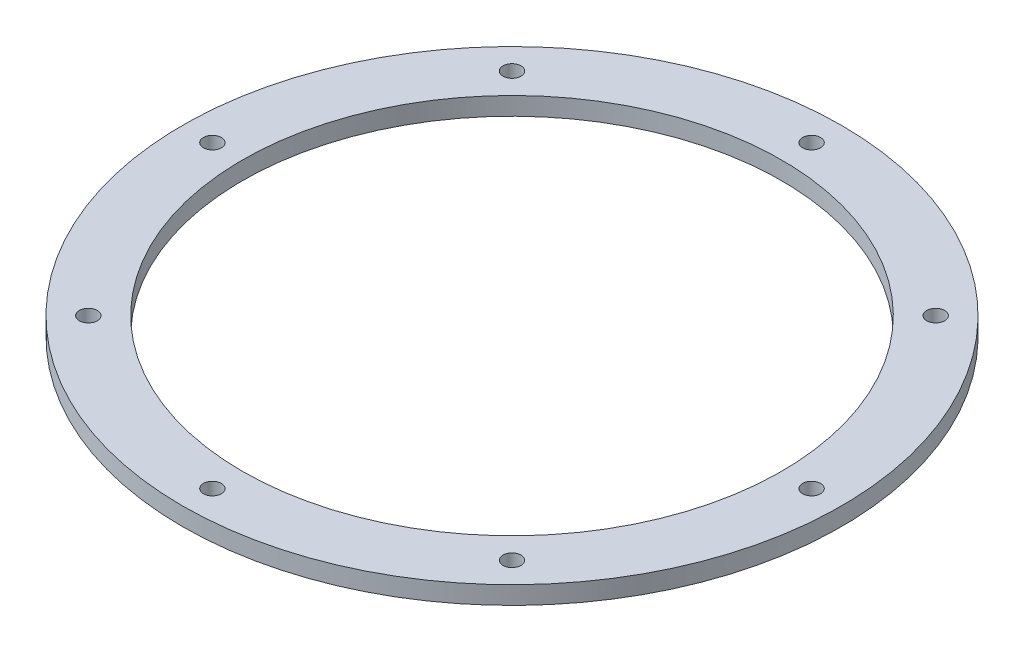
ISO-10303-21;
HEADER;
FILE_DESCRIPTION(('STEP AP214'),'2;1');
FILE_NAME('part.step','',(''),(''),'','','');
FILE_SCHEMA(('AUTOMOTIVE_DESIGN { 1 0 10303 214 1 1 1 1 }'));
ENDSEC;
DATA;
#1=APPLICATION_CONTEXT('core data for automotive mechanical design processes');
#2=APPLICATION_PROTOCOL_DEFINITION('international standard','automotive_design',2000,#1);
#3=PRODUCT_CONTEXT('',#1,'mechanical');
#4=PRODUCT('Part','Part','',(#3));
#5=PRODUCT_RELATED_PRODUCT_CATEGORY('part','',(#4));
#6=PRODUCT_DEFINITION_FORMATION('','',#4);
#7=PRODUCT_DEFINITION_CONTEXT('part definition',#1,'design');
#8=PRODUCT_DEFINITION('design','',#6,#7);
#9=PRODUCT_DEFINITION_SHAPE('','',#8);
#10=(LENGTH_UNIT() NAMED_UNIT(*) SI_UNIT(.MILLI.,.METRE.));
#11=(NAMED_UNIT(*) PLANE_ANGLE_UNIT() SI_UNIT($,.RADIAN.));
#12=(NAMED_UNIT(*) SI_UNIT($,.STERADIAN.) SOLID_ANGLE_UNIT());
#13=UNCERTAINTY_MEASURE_WITH_UNIT(LENGTH_MEASURE(1.E-05),#10,'distance_accuracy_value','');
#14=(GEOMETRIC_REPRESENTATION_CONTEXT(3) GLOBAL_UNCERTAINTY_ASSIGNED_CONTEXT((#13)) GLOBAL_UNIT_ASSIGNED_CONTEXT((#10,
#11,#12)) REPRESENTATION_CONTEXT('',''));
#15=CARTESIAN_POINT('',(0.,0.,0.));
#16=DIRECTION('',(0.,0.,1.));
#17=DIRECTION('',(1.,0.,0.));
#18=AXIS2_PLACEMENT_3D('',#15,#16,#17);
#19=CARTESIAN_POINT('',(0.,3.,0.));
#20=DIRECTION('',(0.,1.,0.));
#21=DIRECTION('',(0.,0.,1.));
#22=AXIS2_PLACEMENT_3D('',#19,#20,#21);
#23=PLANE('',#22);
#24=CARTESIAN_POINT('',(-50.,3.,0.));
#25=DIRECTION('',(0.,1.,0.));
#26=DIRECTION('',(0.,0.,1.));
#27=AXIS2_PLACEMENT_3D('',#24,#25,#26);
#28=CIRCLE('',#27,1.5);
#29=CARTESIAN_POINT('',(-50.,3.,1.49999999999999));
#30=VERTEX_POINT('',#29);
#31=EDGE_CURVE('E115',#30,#30,#28,.T.);
#32=ORIENTED_EDGE('',*,*,#31,.F.);
#33=EDGE_LOOP('',(#32));
#34=FACE_BOUND('',#33,.T.);
#35=CARTESIAN_POINT('',(-35.3553390593273,3.,35.3553390593274));
#36=DIRECTION('',(0.,1.,0.));
#37=DIRECTION('',(0.,0.,1.));
#38=AXIS2_PLACEMENT_3D('',#35,#36,#37);
#39=CIRCLE('',#38,1.5);
#40=CARTESIAN_POINT('',(-35.3553390593273,3.,36.8553390593274));
#41=VERTEX_POINT('',#40);
#42=EDGE_CURVE('E107',#41,#41,#39,.T.);
#43=ORIENTED_EDGE('',*,*,#42,.F.);
#44=EDGE_LOOP('',(#43));
#45=FACE_BOUND('',#44,.T.);
#46=CARTESIAN_POINT('',(0.,3.,50.));
#47=DIRECTION('',(0.,1.,0.));
#48=DIRECTION('',(0.,0.,1.));
#49=AXIS2_PLACEMENT_3D('',#46,#47,#48);
#50=CIRCLE('',#49,1.5);
#51=CARTESIAN_POINT('',(0.,3.,51.5));
#52=VERTEX_POINT('',#51);
#53=EDGE_CURVE('E99',#52,#52,#50,.T.);
#54=ORIENTED_EDGE('',*,*,#53,.F.);
#55=EDGE_LOOP('',(#54));
#56=FACE_BOUND('',#55,.T.);
#57=CARTESIAN_POINT('',(35.3553390593274,3.,35.3553390593274));
#58=DIRECTION('',(0.,1.,0.));
#59=DIRECTION('',(0.,0.,1.));
#60=AXIS2_PLACEMENT_3D('',#57,#58,#59);
#61=CIRCLE('',#60,1.5);
#62=CARTESIAN_POINT('',(35.3553390593274,3.,36.8553390593274));
#63=VERTEX_POINT('',#62);
#64=EDGE_CURVE('E90',#63,#63,#61,.T.);
#65=ORIENTED_EDGE('',*,*,#64,.F.);
#66=EDGE_LOOP('',(#65));
#67=FACE_BOUND('',#66,.T.);
#68=CARTESIAN_POINT('',(50.,3.,0.));
#69=DIRECTION('',(0.,1.,0.));
#70=DIRECTION('',(0.,0.,1.));
#71=AXIS2_PLACEMENT_3D('',#68,#69,#70);
#72=CIRCLE('',#71,1.5);
#73=CARTESIAN_POINT('',(50.,3.,1.5));
#74=VERTEX_POINT('',#73);
#75=EDGE_CURVE('E130',#74,#74,#72,.T.);
#76=ORIENTED_EDGE('',*,*,#75,.F.);
#77=EDGE_LOOP('',(#76));
#78=FACE_BOUND('',#77,.T.);
#79=CARTESIAN_POINT('',(35.3553390593273,3.,-35.3553390593274));
#80=DIRECTION('',(0.,1.,0.));
#81=DIRECTION('',(0.,0.,1.));
#82=AXIS2_PLACEMENT_3D('',#79,#80,#81);
#83=CIRCLE('',#82,1.5);
#84=CARTESIAN_POINT('',(35.3553390593273,3.,-33.8553390593274));
#85=VERTEX_POINT('',#84);
#86=EDGE_CURVE('E122',#85,#85,#83,.T.);
#87=ORIENTED_EDGE('',*,*,#86,.F.);
#88=EDGE_LOOP('',(#87));
#89=FACE_BOUND('',#88,.T.);
#90=CARTESIAN_POINT('',(-35.3553390593274,3.,-35.3553390593274));
#91=DIRECTION('',(0.,1.,0.));
#92=DIRECTION('',(0.,0.,1.));
#93=AXIS2_PLACEMENT_3D('',#90,#91,#92);
#94=CIRCLE('',#93,1.5);
#95=CARTESIAN_POINT('',(-35.3553390593274,3.,-33.8553390593274));
#96=VERTEX_POINT('',#95);
#97=EDGE_CURVE('E82',#96,#96,#94,.T.);
#98=ORIENTED_EDGE('',*,*,#97,.F.);
#99=EDGE_LOOP('',(#98));
#100=FACE_BOUND('',#99,.T.);
#101=CARTESIAN_POINT('',(0.,3.,-50.));
#102=DIRECTION('',(0.,1.,0.));
#103=DIRECTION('',(0.,0.,1.));
#104=AXIS2_PLACEMENT_3D('',#101,#102,#103);
#105=CIRCLE('',#104,1.5);
#106=CARTESIAN_POINT('',(0.,3.,-48.5));
#107=VERTEX_POINT('',#106);
#108=EDGE_CURVE('E74',#107,#107,#105,.T.);
#109=ORIENTED_EDGE('',*,*,#108,.F.);
#110=EDGE_LOOP('',(#109));
#111=FACE_BOUND('',#110,.T.);
#112=CARTESIAN_POINT('',(0.,3.,0.));
#113=DIRECTION('',(0.,1.,0.));
#114=DIRECTION('',(0.,0.,1.));
#115=AXIS2_PLACEMENT_3D('',#112,#113,#114);
#116=CIRCLE('',#115,55.);
#117=CARTESIAN_POINT('',(0.,3.,55.));
#118=VERTEX_POINT('',#117);
#119=EDGE_CURVE('E12',#118,#118,#116,.T.);
#120=ORIENTED_EDGE('',*,*,#119,.T.);
#121=EDGE_LOOP('',(#120));
#122=FACE_BOUND('',#121,.T.);
#123=CARTESIAN_POINT('',(0.,3.,0.));
#124=DIRECTION('',(0.,1.,0.));
#125=DIRECTION('',(0.,0.,1.));
#126=AXIS2_PLACEMENT_3D('',#123,#124,#125);
#127=CIRCLE('',#126,45.);
#128=CARTESIAN_POINT('',(0.,3.,45.));
#129=VERTEX_POINT('',#128);
#130=EDGE_CURVE('E64',#129,#129,#127,.T.);
#131=ORIENTED_EDGE('',*,*,#130,.F.);
#132=EDGE_LOOP('',(#131));
#133=FACE_BOUND('',#132,.T.);
#134=ADVANCED_FACE('F51',(#34,#45,#56,#67,#78,#89,#100,#111,#122,#133),#23,.T.);
#135=CARTESIAN_POINT('',(0.,0.,0.));
#136=DIRECTION('',(0.,1.,0.));
#137=DIRECTION('',(0.,0.,1.));
#138=AXIS2_PLACEMENT_3D('',#135,#136,#137);
#139=PLANE('',#138);
#140=CARTESIAN_POINT('',(-50.,0.,0.));
#141=DIRECTION('',(0.,1.,0.));
#142=DIRECTION('',(0.,0.,1.));
#143=AXIS2_PLACEMENT_3D('',#140,#141,#142);
#144=CIRCLE('',#143,1.5);
#145=CARTESIAN_POINT('',(-50.,0.,1.49999999999999));
#146=VERTEX_POINT('',#145);
#147=EDGE_CURVE('E86',#146,#146,#144,.T.);
#148=ORIENTED_EDGE('',*,*,#147,.T.);
#149=EDGE_LOOP('',(#148));
#150=FACE_BOUND('',#149,.T.);
#151=CARTESIAN_POINT('',(-35.3553390593273,0.,35.3553390593274));
#152=DIRECTION('',(0.,1.,0.));
#153=DIRECTION('',(0.,0.,1.));
#154=AXIS2_PLACEMENT_3D('',#151,#152,#153);
#155=CIRCLE('',#154,1.5);
#156=CARTESIAN_POINT('',(-35.3553390593273,0.,36.8553390593274));
#157=VERTEX_POINT('',#156);
#158=EDGE_CURVE('E111',#157,#157,#155,.T.);
#159=ORIENTED_EDGE('',*,*,#158,.T.);
#160=EDGE_LOOP('',(#159));
#161=FACE_BOUND('',#160,.T.);
#162=CARTESIAN_POINT('',(0.,0.,50.));
#163=DIRECTION('',(0.,1.,0.));
#164=DIRECTION('',(0.,0.,1.));
#165=AXIS2_PLACEMENT_3D('',#162,#163,#164);
#166=CIRCLE('',#165,1.5);
#167=CARTESIAN_POINT('',(0.,0.,51.5));
#168=VERTEX_POINT('',#167);
#169=EDGE_CURVE('E103',#168,#168,#166,.T.);
#170=ORIENTED_EDGE('',*,*,#169,.T.);
#171=EDGE_LOOP('',(#170));
#172=FACE_BOUND('',#171,.T.);
#173=CARTESIAN_POINT('',(35.3553390593274,0.,35.3553390593274));
#174=DIRECTION('',(0.,1.,0.));
#175=DIRECTION('',(0.,0.,1.));
#176=AXIS2_PLACEMENT_3D('',#173,#174,#175);
#177=CIRCLE('',#176,1.5);
#178=CARTESIAN_POINT('',(35.3553390593274,0.,36.8553390593274));
#179=VERTEX_POINT('',#178);
#180=EDGE_CURVE('E94',#179,#179,#177,.T.);
#181=ORIENTED_EDGE('',*,*,#180,.T.);
#182=EDGE_LOOP('',(#181));
#183=FACE_BOUND('',#182,.T.);
#184=CARTESIAN_POINT('',(50.,0.,0.));
#185=DIRECTION('',(0.,1.,0.));
#186=DIRECTION('',(0.,0.,1.));
#187=AXIS2_PLACEMENT_3D('',#184,#185,#186);
#188=CIRCLE('',#187,1.5);
#189=CARTESIAN_POINT('',(50.,0.,1.5));
#190=VERTEX_POINT('',#189);
#191=EDGE_CURVE('E95',#190,#190,#188,.T.);
#192=ORIENTED_EDGE('',*,*,#191,.T.);
#193=EDGE_LOOP('',(#192));
#194=FACE_BOUND('',#193,.T.);
#195=CARTESIAN_POINT('',(35.3553390593273,0.,-35.3553390593274));
#196=DIRECTION('',(0.,1.,0.));
#197=DIRECTION('',(0.,0.,1.));
#198=AXIS2_PLACEMENT_3D('',#195,#196,#197);
#199=CIRCLE('',#198,1.5);
#200=CARTESIAN_POINT('',(35.3553390593273,0.,-33.8553390593274));
#201=VERTEX_POINT('',#200);
#202=EDGE_CURVE('E126',#201,#201,#199,.T.);
#203=ORIENTED_EDGE('',*,*,#202,.T.);
#204=EDGE_LOOP('',(#203));
#205=FACE_BOUND('',#204,.T.);
#206=CARTESIAN_POINT('',(-35.3553390593274,0.,-35.3553390593274));
#207=DIRECTION('',(0.,1.,0.));
#208=DIRECTION('',(0.,0.,1.));
#209=AXIS2_PLACEMENT_3D('',#206,#207,#208);
#210=CIRCLE('',#209,1.5);
#211=CARTESIAN_POINT('',(-35.3553390593274,0.,-33.8553390593274));
#212=VERTEX_POINT('',#211);
#213=EDGE_CURVE('E78',#212,#212,#210,.T.);
#214=ORIENTED_EDGE('',*,*,#213,.T.);
#215=EDGE_LOOP('',(#214));
#216=FACE_BOUND('',#215,.T.);
#217=CARTESIAN_POINT('',(0.,0.,-50.));
#218=DIRECTION('',(0.,1.,0.));
#219=DIRECTION('',(0.,0.,1.));
#220=AXIS2_PLACEMENT_3D('',#217,#218,#219);
#221=CIRCLE('',#220,1.5);
#222=CARTESIAN_POINT('',(0.,0.,-48.5));
#223=VERTEX_POINT('',#222);
#224=EDGE_CURVE('E70',#223,#223,#221,.T.);
#225=ORIENTED_EDGE('',*,*,#224,.T.);
#226=EDGE_LOOP('',(#225));
#227=FACE_BOUND('',#226,.T.);
#228=CARTESIAN_POINT('',(0.,0.,0.));
#229=DIRECTION('',(0.,1.,0.));
#230=DIRECTION('',(0.,0.,1.));
#231=AXIS2_PLACEMENT_3D('',#228,#229,#230);
#232=CIRCLE('',#231,55.);
#233=CARTESIAN_POINT('',(0.,0.,55.));
#234=VERTEX_POINT('',#233);
#235=EDGE_CURVE('E55',#234,#234,#232,.T.);
#236=ORIENTED_EDGE('',*,*,#235,.F.);
#237=EDGE_LOOP('',(#236));
#238=FACE_BOUND('',#237,.T.);
#239=CARTESIAN_POINT('',(0.,0.,0.));
#240=DIRECTION('',(0.,1.,0.));
#241=DIRECTION('',(0.,0.,1.));
#242=AXIS2_PLACEMENT_3D('',#239,#240,#241);
#243=CIRCLE('',#242,45.);
#244=CARTESIAN_POINT('',(0.,0.,45.));
#245=VERTEX_POINT('',#244);
#246=EDGE_CURVE('E66',#245,#245,#243,.T.);
#247=ORIENTED_EDGE('',*,*,#246,.T.);
#248=EDGE_LOOP('',(#247));
#249=FACE_BOUND('',#248,.T.);
#250=ADVANCED_FACE('F138',(#150,#161,#172,#183,#194,#205,#216,#227,#238,#249),#139,.F.);
#251=CARTESIAN_POINT('',(0.,3.,0.));
#252=DIRECTION('',(0.,-1.,0.));
#253=DIRECTION('',(0.,0.,-1.));
#254=AXIS2_PLACEMENT_3D('',#251,#252,#253);
#255=CYLINDRICAL_SURFACE('',#254,55.);
#256=ORIENTED_EDGE('',*,*,#119,.F.);
#257=EDGE_LOOP('',(#256));
#258=FACE_BOUND('',#257,.T.);
#259=ORIENTED_EDGE('',*,*,#235,.T.);
#260=EDGE_LOOP('',(#259));
#261=FACE_BOUND('',#260,.T.);
#262=ADVANCED_FACE('F53',(#258,#261),#255,.T.);
#263=CARTESIAN_POINT('',(0.,3.,0.));
#264=DIRECTION('',(0.,-1.,0.));
#265=DIRECTION('',(0.,0.,-1.));
#266=AXIS2_PLACEMENT_3D('',#263,#264,#265);
#267=CYLINDRICAL_SURFACE('',#266,45.);
#268=ORIENTED_EDGE('',*,*,#130,.T.);
#269=EDGE_LOOP('',(#268));
#270=FACE_BOUND('',#269,.T.);
#271=ORIENTED_EDGE('',*,*,#246,.F.);
#272=EDGE_LOOP('',(#271));
#273=FACE_BOUND('',#272,.T.);
#274=ADVANCED_FACE('F161',(#270,#273),#267,.F.);
#275=CARTESIAN_POINT('',(0.,0.,-50.));
#276=DIRECTION('',(0.,1.,0.));
#277=DIRECTION('',(0.,0.,1.));
#278=AXIS2_PLACEMENT_3D('',#275,#276,#277);
#279=CYLINDRICAL_SURFACE('',#278,1.5);
#280=ORIENTED_EDGE('',*,*,#224,.F.);
#281=EDGE_LOOP('',(#280));
#282=FACE_BOUND('',#281,.T.);
#283=ORIENTED_EDGE('',*,*,#108,.T.);
#284=EDGE_LOOP('',(#283));
#285=FACE_BOUND('',#284,.T.);
#286=ADVANCED_FACE('F164',(#282,#285),#279,.F.);
#287=CARTESIAN_POINT('',(-35.3553390593274,0.,-35.3553390593274));
#288=DIRECTION('',(0.,1.,0.));
#289=DIRECTION('',(0.,0.,1.));
#290=AXIS2_PLACEMENT_3D('',#287,#288,#289);
#291=CYLINDRICAL_SURFACE('',#290,1.5);
#292=ORIENTED_EDGE('',*,*,#213,.F.);
#293=EDGE_LOOP('',(#292));
#294=FACE_BOUND('',#293,.T.);
#295=ORIENTED_EDGE('',*,*,#97,.T.);
#296=EDGE_LOOP('',(#295));
#297=FACE_BOUND('',#296,.T.);
#298=ADVANCED_FACE('F179',(#294,#297),#291,.F.);
#299=CARTESIAN_POINT('',(35.3553390593273,0.,-35.3553390593274));
#300=DIRECTION('',(0.,1.,0.));
#301=DIRECTION('',(0.,0.,1.));
#302=AXIS2_PLACEMENT_3D('',#299,#300,#301);
#303=CYLINDRICAL_SURFACE('',#302,1.5);
#304=ORIENTED_EDGE('',*,*,#202,.F.);
#305=EDGE_LOOP('',(#304));
#306=FACE_BOUND('',#305,.T.);
#307=ORIENTED_EDGE('',*,*,#86,.T.);
#308=EDGE_LOOP('',(#307));
#309=FACE_BOUND('',#308,.T.);
#310=ADVANCED_FACE('F145',(#306,#309),#303,.F.);
#311=CARTESIAN_POINT('',(50.,0.,0.));
#312=DIRECTION('',(0.,1.,0.));
#313=DIRECTION('',(0.,0.,1.));
#314=AXIS2_PLACEMENT_3D('',#311,#312,#313);
#315=CYLINDRICAL_SURFACE('',#314,1.5);
#316=ORIENTED_EDGE('',*,*,#191,.F.);
#317=EDGE_LOOP('',(#316));
#318=FACE_BOUND('',#317,.T.);
#319=ORIENTED_EDGE('',*,*,#75,.T.);
#320=EDGE_LOOP('',(#319));
#321=FACE_BOUND('',#320,.T.);
#322=ADVANCED_FACE('F141',(#318,#321),#315,.F.);
#323=CARTESIAN_POINT('',(35.3553390593274,0.,35.3553390593274));
#324=DIRECTION('',(0.,1.,0.));
#325=DIRECTION('',(0.,0.,1.));
#326=AXIS2_PLACEMENT_3D('',#323,#324,#325);
#327=CYLINDRICAL_SURFACE('',#326,1.5);
#328=ORIENTED_EDGE('',*,*,#180,.F.);
#329=EDGE_LOOP('',(#328));
#330=FACE_BOUND('',#329,.T.);
#331=ORIENTED_EDGE('',*,*,#64,.T.);
#332=EDGE_LOOP('',(#331));
#333=FACE_BOUND('',#332,.T.);
#334=ADVANCED_FACE('F144',(#330,#333),#327,.F.);
#335=CARTESIAN_POINT('',(0.,0.,50.));
#336=DIRECTION('',(0.,1.,0.));
#337=DIRECTION('',(0.,0.,1.));
#338=AXIS2_PLACEMENT_3D('',#335,#336,#337);
#339=CYLINDRICAL_SURFACE('',#338,1.5);
#340=ORIENTED_EDGE('',*,*,#169,.F.);
#341=EDGE_LOOP('',(#340));
#342=FACE_BOUND('',#341,.T.);
#343=ORIENTED_EDGE('',*,*,#53,.T.);
#344=EDGE_LOOP('',(#343));
#345=FACE_BOUND('',#344,.T.);
#346=ADVANCED_FACE('F185',(#342,#345),#339,.F.);
#347=CARTESIAN_POINT('',(-35.3553390593273,0.,35.3553390593274));
#348=DIRECTION('',(0.,1.,0.));
#349=DIRECTION('',(0.,0.,1.));
#350=AXIS2_PLACEMENT_3D('',#347,#348,#349);
#351=CYLINDRICAL_SURFACE('',#350,1.5);
#352=ORIENTED_EDGE('',*,*,#158,.F.);
#353=EDGE_LOOP('',(#352));
#354=FACE_BOUND('',#353,.T.);
#355=ORIENTED_EDGE('',*,*,#42,.T.);
#356=EDGE_LOOP('',(#355));
#357=FACE_BOUND('',#356,.T.);
#358=ADVANCED_FACE('F189',(#354,#357),#351,.F.);
#359=CARTESIAN_POINT('',(-50.,0.,0.));
#360=DIRECTION('',(0.,1.,0.));
#361=DIRECTION('',(0.,0.,1.));
#362=AXIS2_PLACEMENT_3D('',#359,#360,#361);
#363=CYLINDRICAL_SURFACE('',#362,1.5);
#364=ORIENTED_EDGE('',*,*,#147,.F.);
#365=EDGE_LOOP('',(#364));
#366=FACE_BOUND('',#365,.T.);
#367=ORIENTED_EDGE('',*,*,#31,.T.);
#368=EDGE_LOOP('',(#367));
#369=FACE_BOUND('',#368,.T.);
#370=ADVANCED_FACE('F193',(#366,#369),#363,.F.);
#371=CLOSED_SHELL('',(#134,#250,#262,#274,#286,#298,#310,#322,#334,#346,#358,#370));
#372=MANIFOLD_SOLID_BREP('B2',#371);
#373=ADVANCED_BREP_SHAPE_REPRESENTATION('',(#18,#372),#14);
#374=SHAPE_DEFINITION_REPRESENTATION(#9,#373);
ENDSEC;
END-ISO-10303-21;
